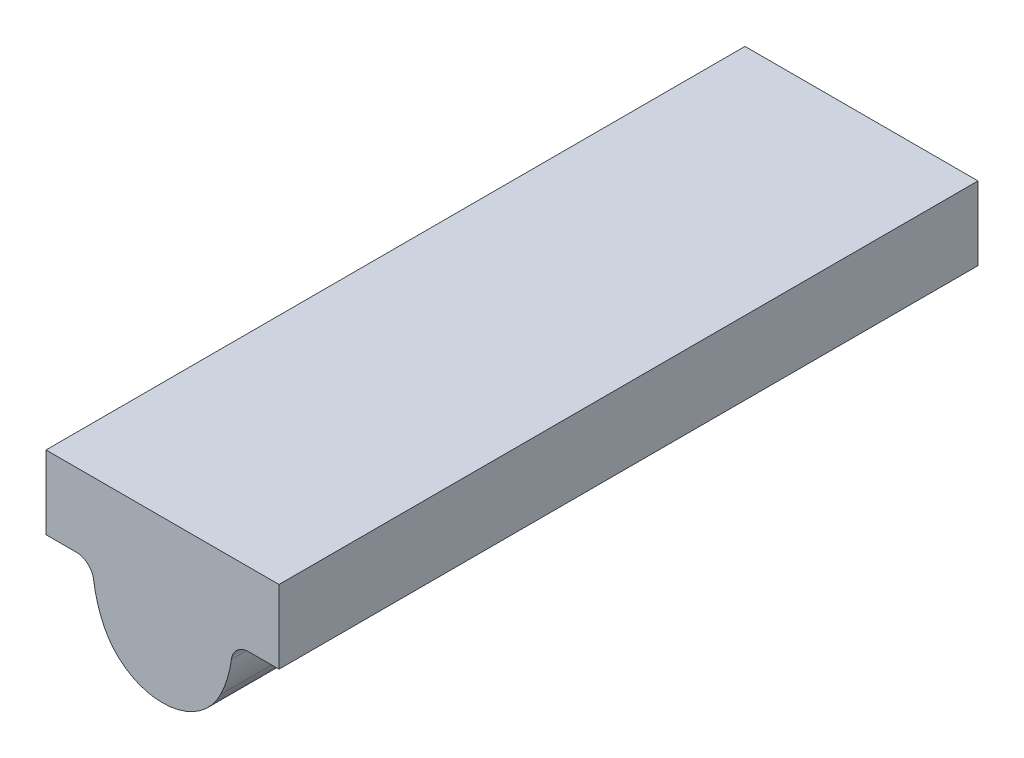
ISO-10303-21;
HEADER;
FILE_DESCRIPTION(('STEP AP214'),'2;1');
FILE_NAME('part.step','',(''),(''),'','','');
FILE_SCHEMA(('AUTOMOTIVE_DESIGN { 1 0 10303 214 1 1 1 1 }'));
ENDSEC;
DATA;
#1=APPLICATION_CONTEXT('core data for automotive mechanical design processes');
#2=APPLICATION_PROTOCOL_DEFINITION('international standard','automotive_design',2000,#1);
#3=PRODUCT_CONTEXT('',#1,'mechanical');
#4=PRODUCT('Part','Part','',(#3));
#5=PRODUCT_RELATED_PRODUCT_CATEGORY('part','',(#4));
#6=PRODUCT_DEFINITION_FORMATION('','',#4);
#7=PRODUCT_DEFINITION_CONTEXT('part definition',#1,'design');
#8=PRODUCT_DEFINITION('design','',#6,#7);
#9=PRODUCT_DEFINITION_SHAPE('','',#8);
#10=(LENGTH_UNIT() NAMED_UNIT(*) SI_UNIT(.MILLI.,.METRE.));
#11=(NAMED_UNIT(*) PLANE_ANGLE_UNIT() SI_UNIT($,.RADIAN.));
#12=(NAMED_UNIT(*) SI_UNIT($,.STERADIAN.) SOLID_ANGLE_UNIT());
#13=UNCERTAINTY_MEASURE_WITH_UNIT(LENGTH_MEASURE(1.E-05),#10,'distance_accuracy_value','');
#14=(GEOMETRIC_REPRESENTATION_CONTEXT(3) GLOBAL_UNCERTAINTY_ASSIGNED_CONTEXT((#13)) GLOBAL_UNIT_ASSIGNED_CONTEXT((#10,
#11,#12)) REPRESENTATION_CONTEXT('',''));
#15=CARTESIAN_POINT('',(0.,0.,0.));
#16=DIRECTION('',(0.,0.,1.));
#17=DIRECTION('',(1.,0.,0.));
#18=AXIS2_PLACEMENT_3D('',#15,#16,#17);
#19=CARTESIAN_POINT('',(-0.740175425099138,0.6,3.));
#20=DIRECTION('',(0.,0.,-1.));
#21=DIRECTION('',(-1.,0.,0.));
#22=AXIS2_PLACEMENT_3D('',#19,#20,#21);
#23=CYLINDRICAL_SURFACE('',#22,0.15);
#24=CARTESIAN_POINT('',(-0.740175425099138,0.6,-3.));
#25=DIRECTION('',(0.,0.,-1.));
#26=DIRECTION('',(-1.,0.,0.));
#27=AXIS2_PLACEMENT_3D('',#24,#25,#26);
#28=CIRCLE('',#27,0.15);
#29=CARTESIAN_POINT('',(-0.740175425099138,0.75,-3.));
#30=VERTEX_POINT('',#29);
#31=CARTESIAN_POINT('',(-0.591456891390555,0.619565217391304,-3.));
#32=VERTEX_POINT('',#31);
#33=EDGE_CURVE('E141',#30,#32,#28,.T.);
#34=ORIENTED_EDGE('',*,*,#33,.T.);
#35=DIRECTION('',(0.,0.,-1.));
#36=VECTOR('',#35,1.);
#37=CARTESIAN_POINT('',(-0.591456891390555,0.619565217391304,3.));
#38=LINE('',#37,#36);
#39=CARTESIAN_POINT('',(-0.591456891390555,0.619565217391304,3.));
#40=VERTEX_POINT('',#39);
#41=EDGE_CURVE('E11',#40,#32,#38,.T.);
#42=ORIENTED_EDGE('',*,*,#41,.F.);
#43=CARTESIAN_POINT('',(-0.740175425099138,0.6,3.));
#44=DIRECTION('',(0.,0.,-1.));
#45=DIRECTION('',(-1.,0.,0.));
#46=AXIS2_PLACEMENT_3D('',#43,#44,#45);
#47=CIRCLE('',#46,0.15);
#48=CARTESIAN_POINT('',(-0.740175425099138,0.75,3.));
#49=VERTEX_POINT('',#48);
#50=EDGE_CURVE('E159',#49,#40,#47,.T.);
#51=ORIENTED_EDGE('',*,*,#50,.F.);
#52=DIRECTION('',(0.,0.,-1.));
#53=VECTOR('',#52,1.);
#54=CARTESIAN_POINT('',(-0.740175425099138,0.75,3.));
#55=LINE('',#54,#53);
#56=EDGE_CURVE('E137',#49,#30,#55,.T.);
#57=ORIENTED_EDGE('',*,*,#56,.T.);
#58=EDGE_LOOP('',(#34,#42,#51,#57));
#59=FACE_BOUND('',#58,.T.);
#60=ADVANCED_FACE('F33',(#59),#23,.F.);
#61=CARTESIAN_POINT('',(0.4,0.75,3.));
#62=DIRECTION('',(0.,0.,-1.));
#63=DIRECTION('',(-1.,0.,0.));
#64=AXIS2_PLACEMENT_3D('',#61,#62,#63);
#65=CYLINDRICAL_SURFACE('',#64,1.);
#66=CARTESIAN_POINT('',(0.4,0.75,-3.));
#67=DIRECTION('',(0.,0.,1.));
#68=DIRECTION('',(-1.,0.,0.));
#69=AXIS2_PLACEMENT_3D('',#66,#67,#68);
#70=CIRCLE('',#69,1.);
#71=CARTESIAN_POINT('',(-0.498876404494383,0.311797752808991,-3.));
#72=VERTEX_POINT('',#71);
#73=EDGE_CURVE('E144',#32,#72,#70,.T.);
#74=ORIENTED_EDGE('',*,*,#73,.T.);
#75=DIRECTION('',(0.,0.,-1.));
#76=VECTOR('',#75,1.);
#77=CARTESIAN_POINT('',(-0.498876404494383,0.311797752808991,3.));
#78=LINE('',#77,#76);
#79=CARTESIAN_POINT('',(-0.498876404494383,0.311797752808991,3.));
#80=VERTEX_POINT('',#79);
#81=EDGE_CURVE('E41',#80,#72,#78,.T.);
#82=ORIENTED_EDGE('',*,*,#81,.F.);
#83=CARTESIAN_POINT('',(0.4,0.75,3.));
#84=DIRECTION('',(0.,0.,1.));
#85=DIRECTION('',(-1.,0.,0.));
#86=AXIS2_PLACEMENT_3D('',#83,#84,#85);
#87=CIRCLE('',#86,1.);
#88=EDGE_CURVE('E98',#40,#80,#87,.T.);
#89=ORIENTED_EDGE('',*,*,#88,.F.);
#90=ORIENTED_EDGE('',*,*,#41,.T.);
#91=EDGE_LOOP('',(#74,#82,#89,#90));
#92=FACE_BOUND('',#91,.T.);
#93=ADVANCED_FACE('F208',(#92),#65,.T.);
#94=CARTESIAN_POINT('',(0.,0.555000000000001,3.));
#95=DIRECTION('',(0.,0.,-1.));
#96=DIRECTION('',(-1.,0.,0.));
#97=AXIS2_PLACEMENT_3D('',#94,#95,#96);
#98=CYLINDRICAL_SURFACE('',#97,0.555);
#99=CARTESIAN_POINT('',(0.,0.555000000000001,-3.));
#100=DIRECTION('',(0.,0.,1.));
#101=DIRECTION('',(1.,0.,0.));
#102=AXIS2_PLACEMENT_3D('',#99,#100,#101);
#103=CIRCLE('',#102,0.555);
#104=CARTESIAN_POINT('',(0.498876404494383,0.311797752808991,-3.));
#105=VERTEX_POINT('',#104);
#106=EDGE_CURVE('E146',#72,#105,#103,.T.);
#107=ORIENTED_EDGE('',*,*,#106,.T.);
#108=DIRECTION('',(0.,0.,-1.));
#109=VECTOR('',#108,1.);
#110=CARTESIAN_POINT('',(0.498876404494383,0.311797752808991,3.));
#111=LINE('',#110,#109);
#112=CARTESIAN_POINT('',(0.498876404494383,0.311797752808991,3.));
#113=VERTEX_POINT('',#112);
#114=EDGE_CURVE('E172',#113,#105,#111,.T.);
#115=ORIENTED_EDGE('',*,*,#114,.F.);
#116=CARTESIAN_POINT('',(0.,0.555000000000001,3.));
#117=DIRECTION('',(0.,0.,1.));
#118=DIRECTION('',(1.,0.,0.));
#119=AXIS2_PLACEMENT_3D('',#116,#117,#118);
#120=CIRCLE('',#119,0.555);
#121=EDGE_CURVE('E180',#80,#113,#120,.T.);
#122=ORIENTED_EDGE('',*,*,#121,.F.);
#123=ORIENTED_EDGE('',*,*,#81,.T.);
#124=EDGE_LOOP('',(#107,#115,#122,#123));
#125=FACE_BOUND('',#124,.T.);
#126=ADVANCED_FACE('F178',(#125),#98,.T.);
#127=CARTESIAN_POINT('',(-0.4,0.75,3.));
#128=DIRECTION('',(0.,0.,-1.));
#129=DIRECTION('',(-1.,0.,0.));
#130=AXIS2_PLACEMENT_3D('',#127,#128,#129);
#131=CYLINDRICAL_SURFACE('',#130,1.);
#132=CARTESIAN_POINT('',(-0.4,0.75,-3.));
#133=DIRECTION('',(0.,0.,1.));
#134=DIRECTION('',(1.,0.,0.));
#135=AXIS2_PLACEMENT_3D('',#132,#133,#134);
#136=CIRCLE('',#135,1.);
#137=CARTESIAN_POINT('',(0.591456891390555,0.619565217391305,-3.));
#138=VERTEX_POINT('',#137);
#139=EDGE_CURVE('E148',#105,#138,#136,.T.);
#140=ORIENTED_EDGE('',*,*,#139,.T.);
#141=DIRECTION('',(0.,0.,-1.));
#142=VECTOR('',#141,1.);
#143=CARTESIAN_POINT('',(0.591456891390555,0.619565217391305,3.));
#144=LINE('',#143,#142);
#145=CARTESIAN_POINT('',(0.591456891390555,0.619565217391305,3.));
#146=VERTEX_POINT('',#145);
#147=EDGE_CURVE('E169',#146,#138,#144,.T.);
#148=ORIENTED_EDGE('',*,*,#147,.F.);
#149=CARTESIAN_POINT('',(-0.4,0.75,3.));
#150=DIRECTION('',(0.,0.,1.));
#151=DIRECTION('',(1.,0.,0.));
#152=AXIS2_PLACEMENT_3D('',#149,#150,#151);
#153=CIRCLE('',#152,1.);
#154=EDGE_CURVE('E198',#113,#146,#153,.T.);
#155=ORIENTED_EDGE('',*,*,#154,.F.);
#156=ORIENTED_EDGE('',*,*,#114,.T.);
#157=EDGE_LOOP('',(#140,#148,#155,#156));
#158=FACE_BOUND('',#157,.T.);
#159=ADVANCED_FACE('F189',(#158),#131,.T.);
#160=CARTESIAN_POINT('',(0.740175425099138,0.6,3.));
#161=DIRECTION('',(0.,0.,-1.));
#162=DIRECTION('',(-1.,0.,0.));
#163=AXIS2_PLACEMENT_3D('',#160,#161,#162);
#164=CYLINDRICAL_SURFACE('',#163,0.15);
#165=CARTESIAN_POINT('',(0.740175425099138,0.6,-3.));
#166=DIRECTION('',(0.,0.,-1.));
#167=DIRECTION('',(1.,0.,0.));
#168=AXIS2_PLACEMENT_3D('',#165,#166,#167);
#169=CIRCLE('',#168,0.15);
#170=CARTESIAN_POINT('',(0.740175425099138,0.75,-3.));
#171=VERTEX_POINT('',#170);
#172=EDGE_CURVE('E150',#138,#171,#169,.T.);
#173=ORIENTED_EDGE('',*,*,#172,.T.);
#174=DIRECTION('',(0.,0.,-1.));
#175=VECTOR('',#174,1.);
#176=CARTESIAN_POINT('',(0.740175425099138,0.75,3.));
#177=LINE('',#176,#175);
#178=CARTESIAN_POINT('',(0.740175425099138,0.75,3.));
#179=VERTEX_POINT('',#178);
#180=EDGE_CURVE('E166',#179,#171,#177,.T.);
#181=ORIENTED_EDGE('',*,*,#180,.F.);
#182=CARTESIAN_POINT('',(0.740175425099138,0.6,3.));
#183=DIRECTION('',(0.,0.,-1.));
#184=DIRECTION('',(1.,0.,0.));
#185=AXIS2_PLACEMENT_3D('',#182,#183,#184);
#186=CIRCLE('',#185,0.15);
#187=EDGE_CURVE('E195',#146,#179,#186,.T.);
#188=ORIENTED_EDGE('',*,*,#187,.F.);
#189=ORIENTED_EDGE('',*,*,#147,.T.);
#190=EDGE_LOOP('',(#173,#181,#188,#189));
#191=FACE_BOUND('',#190,.T.);
#192=ADVANCED_FACE('F193',(#191),#164,.F.);
#193=CARTESIAN_POINT('',(0.740175425099138,0.75,3.));
#194=DIRECTION('',(0.,1.,0.));
#195=DIRECTION('',(-1.,0.,0.));
#196=AXIS2_PLACEMENT_3D('',#193,#194,#195);
#197=PLANE('',#196);
#198=DIRECTION('',(1.,0.,0.));
#199=VECTOR('',#198,1.);
#200=CARTESIAN_POINT('',(0.740175425099138,0.75,-3.));
#201=LINE('',#200,#199);
#202=CARTESIAN_POINT('',(1.,0.75,-3.));
#203=VERTEX_POINT('',#202);
#204=EDGE_CURVE('E152',#171,#203,#201,.T.);
#205=ORIENTED_EDGE('',*,*,#204,.T.);
#206=DIRECTION('',(0.,0.,-1.));
#207=VECTOR('',#206,1.);
#208=CARTESIAN_POINT('',(1.,0.75,3.));
#209=LINE('',#208,#207);
#210=CARTESIAN_POINT('',(1.,0.75,3.));
#211=VERTEX_POINT('',#210);
#212=EDGE_CURVE('E163',#211,#203,#209,.T.);
#213=ORIENTED_EDGE('',*,*,#212,.F.);
#214=DIRECTION('',(1.,0.,0.));
#215=VECTOR('',#214,1.);
#216=CARTESIAN_POINT('',(0.740175425099138,0.75,3.));
#217=LINE('',#216,#215);
#218=EDGE_CURVE('E197',#179,#211,#217,.T.);
#219=ORIENTED_EDGE('',*,*,#218,.F.);
#220=ORIENTED_EDGE('',*,*,#180,.T.);
#221=EDGE_LOOP('',(#205,#213,#219,#220));
#222=FACE_BOUND('',#221,.T.);
#223=ADVANCED_FACE('F220',(#222),#197,.F.);
#224=CARTESIAN_POINT('',(1.,1.38,3.));
#225=DIRECTION('',(-1.,0.,0.));
#226=DIRECTION('',(0.,0.,1.));
#227=AXIS2_PLACEMENT_3D('',#224,#225,#226);
#228=PLANE('',#227);
#229=DIRECTION('',(0.,1.,0.));
#230=VECTOR('',#229,1.);
#231=CARTESIAN_POINT('',(1.,1.38,-3.));
#232=LINE('',#231,#230);
#233=CARTESIAN_POINT('',(1.,1.38,-3.));
#234=VERTEX_POINT('',#233);
#235=EDGE_CURVE('E154',#203,#234,#232,.T.);
#236=ORIENTED_EDGE('',*,*,#235,.T.);
#237=DIRECTION('',(0.,0.,-1.));
#238=VECTOR('',#237,1.);
#239=CARTESIAN_POINT('',(1.,1.38,3.));
#240=LINE('',#239,#238);
#241=CARTESIAN_POINT('',(1.,1.38,3.));
#242=VERTEX_POINT('',#241);
#243=EDGE_CURVE('E132',#242,#234,#240,.T.);
#244=ORIENTED_EDGE('',*,*,#243,.F.);
#245=DIRECTION('',(0.,1.,0.));
#246=VECTOR('',#245,1.);
#247=CARTESIAN_POINT('',(1.,1.38,3.));
#248=LINE('',#247,#246);
#249=EDGE_CURVE('E123',#211,#242,#248,.T.);
#250=ORIENTED_EDGE('',*,*,#249,.F.);
#251=ORIENTED_EDGE('',*,*,#212,.T.);
#252=EDGE_LOOP('',(#236,#244,#250,#251));
#253=FACE_BOUND('',#252,.T.);
#254=ADVANCED_FACE('F223',(#253),#228,.F.);
#255=CARTESIAN_POINT('',(-1.,1.38,3.));
#256=DIRECTION('',(0.,-1.,0.));
#257=DIRECTION('',(0.,0.,-1.));
#258=AXIS2_PLACEMENT_3D('',#255,#256,#257);
#259=PLANE('',#258);
#260=DIRECTION('',(-1.,0.,0.));
#261=VECTOR('',#260,1.);
#262=CARTESIAN_POINT('',(-1.,1.38,-3.));
#263=LINE('',#262,#261);
#264=CARTESIAN_POINT('',(-1.,1.38,-3.));
#265=VERTEX_POINT('',#264);
#266=EDGE_CURVE('E131',#234,#265,#263,.T.);
#267=ORIENTED_EDGE('',*,*,#266,.T.);
#268=DIRECTION('',(0.,0.,-1.));
#269=VECTOR('',#268,1.);
#270=CARTESIAN_POINT('',(-1.,1.38,3.));
#271=LINE('',#270,#269);
#272=CARTESIAN_POINT('',(-1.,1.38,3.));
#273=VERTEX_POINT('',#272);
#274=EDGE_CURVE('E128',#273,#265,#271,.T.);
#275=ORIENTED_EDGE('',*,*,#274,.F.);
#276=DIRECTION('',(-1.,0.,0.));
#277=VECTOR('',#276,1.);
#278=CARTESIAN_POINT('',(-1.,1.38,3.));
#279=LINE('',#278,#277);
#280=EDGE_CURVE('E117',#242,#273,#279,.T.);
#281=ORIENTED_EDGE('',*,*,#280,.F.);
#282=ORIENTED_EDGE('',*,*,#243,.T.);
#283=EDGE_LOOP('',(#267,#275,#281,#282));
#284=FACE_BOUND('',#283,.T.);
#285=ADVANCED_FACE('F129',(#284),#259,.F.);
#286=CARTESIAN_POINT('',(-1.,1.38,3.));
#287=DIRECTION('',(1.,0.,0.));
#288=DIRECTION('',(0.,0.,-1.));
#289=AXIS2_PLACEMENT_3D('',#286,#287,#288);
#290=PLANE('',#289);
#291=DIRECTION('',(0.,-1.,0.));
#292=VECTOR('',#291,1.);
#293=CARTESIAN_POINT('',(-1.,1.38,-3.));
#294=LINE('',#293,#292);
#295=CARTESIAN_POINT('',(-1.,0.75,-3.));
#296=VERTEX_POINT('',#295);
#297=EDGE_CURVE('E84',#265,#296,#294,.T.);
#298=ORIENTED_EDGE('',*,*,#297,.T.);
#299=DIRECTION('',(0.,0.,-1.));
#300=VECTOR('',#299,1.);
#301=CARTESIAN_POINT('',(-1.,0.75,3.));
#302=LINE('',#301,#300);
#303=CARTESIAN_POINT('',(-1.,0.75,3.));
#304=VERTEX_POINT('',#303);
#305=EDGE_CURVE('E133',#304,#296,#302,.T.);
#306=ORIENTED_EDGE('',*,*,#305,.F.);
#307=DIRECTION('',(0.,-1.,0.));
#308=VECTOR('',#307,1.);
#309=CARTESIAN_POINT('',(-1.,1.38,3.));
#310=LINE('',#309,#308);
#311=EDGE_CURVE('E121',#273,#304,#310,.T.);
#312=ORIENTED_EDGE('',*,*,#311,.F.);
#313=ORIENTED_EDGE('',*,*,#274,.T.);
#314=EDGE_LOOP('',(#298,#306,#312,#313));
#315=FACE_BOUND('',#314,.T.);
#316=ADVANCED_FACE('F135',(#315),#290,.F.);
#317=CARTESIAN_POINT('',(-0.740175425099138,0.75,3.));
#318=DIRECTION('',(0.,1.,0.));
#319=DIRECTION('',(-1.,0.,0.));
#320=AXIS2_PLACEMENT_3D('',#317,#318,#319);
#321=PLANE('',#320);
#322=DIRECTION('',(1.,0.,0.));
#323=VECTOR('',#322,1.);
#324=CARTESIAN_POINT('',(-0.740175425099138,0.75,-3.));
#325=LINE('',#324,#323);
#326=EDGE_CURVE('E90',#296,#30,#325,.T.);
#327=ORIENTED_EDGE('',*,*,#326,.T.);
#328=ORIENTED_EDGE('',*,*,#56,.F.);
#329=DIRECTION('',(1.,0.,0.));
#330=VECTOR('',#329,1.);
#331=CARTESIAN_POINT('',(-0.740175425099138,0.75,3.));
#332=LINE('',#331,#330);
#333=EDGE_CURVE('E49',#304,#49,#332,.T.);
#334=ORIENTED_EDGE('',*,*,#333,.F.);
#335=ORIENTED_EDGE('',*,*,#305,.T.);
#336=EDGE_LOOP('',(#327,#328,#334,#335));
#337=FACE_BOUND('',#336,.T.);
#338=ADVANCED_FACE('F232',(#337),#321,.F.);
#339=CARTESIAN_POINT('',(-0.740175425099138,0.6,3.));
#340=DIRECTION('',(0.,0.,-1.));
#341=DIRECTION('',(-1.,0.,0.));
#342=AXIS2_PLACEMENT_3D('',#339,#340,#341);
#343=PLANE('',#342);
#344=ORIENTED_EDGE('',*,*,#50,.T.);
#345=ORIENTED_EDGE('',*,*,#88,.T.);
#346=ORIENTED_EDGE('',*,*,#121,.T.);
#347=ORIENTED_EDGE('',*,*,#154,.T.);
#348=ORIENTED_EDGE('',*,*,#187,.T.);
#349=ORIENTED_EDGE('',*,*,#218,.T.);
#350=ORIENTED_EDGE('',*,*,#249,.T.);
#351=ORIENTED_EDGE('',*,*,#280,.T.);
#352=ORIENTED_EDGE('',*,*,#311,.T.);
#353=ORIENTED_EDGE('',*,*,#333,.T.);
#354=EDGE_LOOP('',(#344,#345,#346,#347,#348,#349,#350,#351,#352,#353));
#355=FACE_BOUND('',#354,.T.);
#356=ADVANCED_FACE('F119',(#355),#343,.F.);
#357=CARTESIAN_POINT('',(-0.740175425099138,0.6,-3.));
#358=DIRECTION('',(0.,0.,-1.));
#359=DIRECTION('',(-1.,0.,0.));
#360=AXIS2_PLACEMENT_3D('',#357,#358,#359);
#361=PLANE('',#360);
#362=ORIENTED_EDGE('',*,*,#33,.F.);
#363=ORIENTED_EDGE('',*,*,#326,.F.);
#364=ORIENTED_EDGE('',*,*,#297,.F.);
#365=ORIENTED_EDGE('',*,*,#266,.F.);
#366=ORIENTED_EDGE('',*,*,#235,.F.);
#367=ORIENTED_EDGE('',*,*,#204,.F.);
#368=ORIENTED_EDGE('',*,*,#172,.F.);
#369=ORIENTED_EDGE('',*,*,#139,.F.);
#370=ORIENTED_EDGE('',*,*,#106,.F.);
#371=ORIENTED_EDGE('',*,*,#73,.F.);
#372=EDGE_LOOP('',(#362,#363,#364,#365,#366,#367,#368,#369,#370,#371));
#373=FACE_BOUND('',#372,.T.);
#374=ADVANCED_FACE('F184',(#373),#361,.T.);
#375=CLOSED_SHELL('',(#60,#93,#126,#159,#192,#223,#254,#285,#316,#338,#356,#374));
#376=MANIFOLD_SOLID_BREP('B2',#375);
#377=ADVANCED_BREP_SHAPE_REPRESENTATION('',(#18,#376),#14);
#378=SHAPE_DEFINITION_REPRESENTATION(#9,#377);
ENDSEC;
END-ISO-10303-21;
